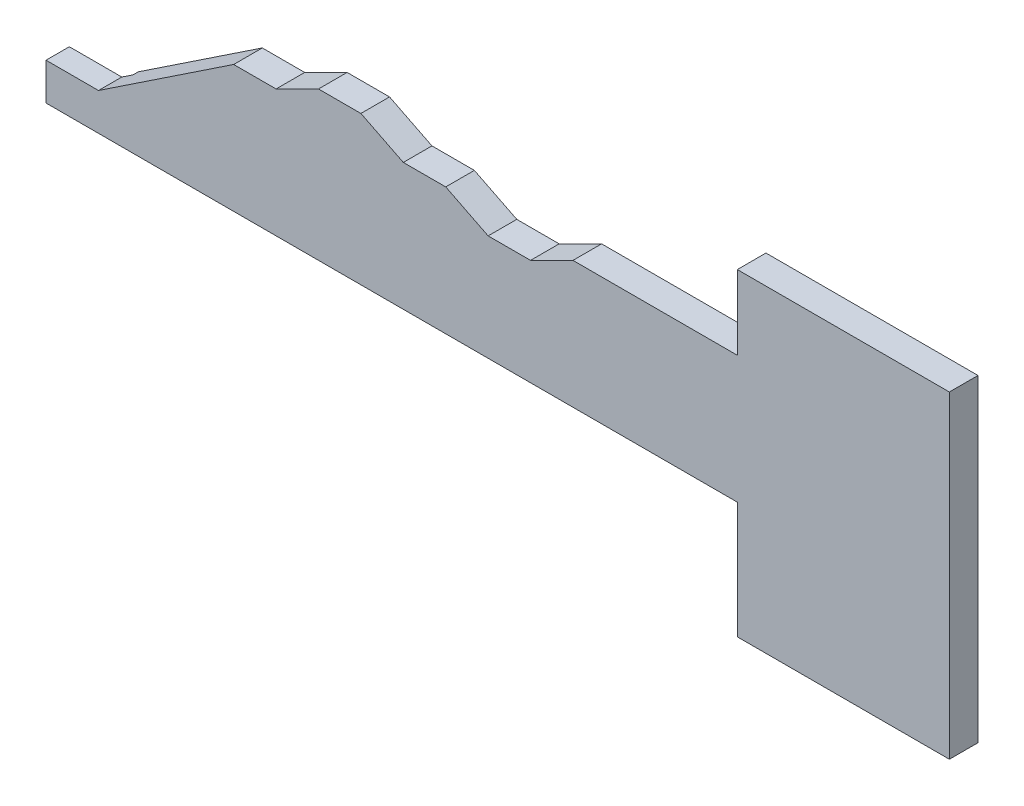
ISO-10303-21;
HEADER;
FILE_DESCRIPTION(('STEP AP214'),'2;1');
FILE_NAME('part.step','',(''),(''),'','','');
FILE_SCHEMA(('AUTOMOTIVE_DESIGN { 1 0 10303 214 1 1 1 1 }'));
ENDSEC;
DATA;
#1=APPLICATION_CONTEXT('core data for automotive mechanical design processes');
#2=APPLICATION_PROTOCOL_DEFINITION('international standard','automotive_design',2000,#1);
#3=PRODUCT_CONTEXT('',#1,'mechanical');
#4=PRODUCT('Part','Part','',(#3));
#5=PRODUCT_RELATED_PRODUCT_CATEGORY('part','',(#4));
#6=PRODUCT_DEFINITION_FORMATION('','',#4);
#7=PRODUCT_DEFINITION_CONTEXT('part definition',#1,'design');
#8=PRODUCT_DEFINITION('design','',#6,#7);
#9=PRODUCT_DEFINITION_SHAPE('','',#8);
#10=(LENGTH_UNIT() NAMED_UNIT(*) SI_UNIT(.MILLI.,.METRE.));
#11=(NAMED_UNIT(*) PLANE_ANGLE_UNIT() SI_UNIT($,.RADIAN.));
#12=(NAMED_UNIT(*) SI_UNIT($,.STERADIAN.) SOLID_ANGLE_UNIT());
#13=UNCERTAINTY_MEASURE_WITH_UNIT(LENGTH_MEASURE(1.E-05),#10,'distance_accuracy_value','');
#14=(GEOMETRIC_REPRESENTATION_CONTEXT(3) GLOBAL_UNCERTAINTY_ASSIGNED_CONTEXT((#13)) GLOBAL_UNIT_ASSIGNED_CONTEXT((#10,
#11,#12)) REPRESENTATION_CONTEXT('',''));
#15=CARTESIAN_POINT('',(0.,0.,0.));
#16=DIRECTION('',(0.,0.,1.));
#17=DIRECTION('',(1.,0.,0.));
#18=AXIS2_PLACEMENT_3D('',#15,#16,#17);
#19=CARTESIAN_POINT('',(-18.3076923076923,27.4615384615385,2.7));
#20=DIRECTION('',(-0.554700196225229,0.832050294337843,0.));
#21=DIRECTION('',(-0.832050294337843,-0.554700196225229,0.));
#22=AXIS2_PLACEMENT_3D('',#19,#20,#21);
#23=PLANE('',#22);
#24=DIRECTION('',(0.832050294337844,0.554700196225229,0.));
#25=VECTOR('',#24,1.);
#26=CARTESIAN_POINT('',(-18.3076923076923,27.4615384615385,0.));
#27=LINE('',#26,#25);
#28=CARTESIAN_POINT('',(-59.2,0.199999999999988,0.));
#29=VERTEX_POINT('',#28);
#30=CARTESIAN_POINT('',(-47.5,7.99999999999999,0.));
#31=VERTEX_POINT('',#30);
#32=EDGE_CURVE('E128',#29,#31,#27,.T.);
#33=ORIENTED_EDGE('',*,*,#32,.F.);
#34=DIRECTION('',(0.,0.,-1.));
#35=VECTOR('',#34,1.);
#36=CARTESIAN_POINT('',(-59.2,0.199999999999995,0.5));
#37=LINE('',#36,#35);
#38=CARTESIAN_POINT('',(-59.2,0.199999999999995,0.5));
#39=VERTEX_POINT('',#38);
#40=EDGE_CURVE('E62',#39,#29,#37,.T.);
#41=ORIENTED_EDGE('',*,*,#40,.F.);
#42=DIRECTION('',(-0.832050294337843,-0.554700196225229,0.));
#43=VECTOR('',#42,1.);
#44=CARTESIAN_POINT('',(-18.3076923076923,27.4615384615385,0.5));
#45=LINE('',#44,#43);
#46=CARTESIAN_POINT('',(-60.25,-0.499999999999992,0.5));
#47=VERTEX_POINT('',#46);
#48=EDGE_CURVE('E343',#39,#47,#45,.T.);
#49=ORIENTED_EDGE('',*,*,#48,.T.);
#50=DIRECTION('',(0.,0.,-1.));
#51=VECTOR('',#50,1.);
#52=CARTESIAN_POINT('',(-60.25,-0.499999999999997,2.7));
#53=LINE('',#52,#51);
#54=CARTESIAN_POINT('',(-60.25,-0.499999999999997,2.7));
#55=VERTEX_POINT('',#54);
#56=EDGE_CURVE('E11',#55,#47,#53,.T.);
#57=ORIENTED_EDGE('',*,*,#56,.F.);
#58=DIRECTION('',(0.832050294337844,0.554700196225229,0.));
#59=VECTOR('',#58,1.);
#60=CARTESIAN_POINT('',(-18.3076923076923,27.4615384615385,2.7));
#61=LINE('',#60,#59);
#62=CARTESIAN_POINT('',(-47.5,7.99999999999999,2.7));
#63=VERTEX_POINT('',#62);
#64=EDGE_CURVE('E267',#55,#63,#61,.T.);
#65=ORIENTED_EDGE('',*,*,#64,.T.);
#66=DIRECTION('',(0.,0.,-1.));
#67=VECTOR('',#66,1.);
#68=CARTESIAN_POINT('',(-47.5,7.99999999999999,2.7));
#69=LINE('',#68,#67);
#70=EDGE_CURVE('E212',#63,#31,#69,.T.);
#71=ORIENTED_EDGE('',*,*,#70,.T.);
#72=EDGE_LOOP('',(#33,#41,#49,#57,#65,#71));
#73=FACE_BOUND('',#72,.T.);
#74=ADVANCED_FACE('F47',(#73),#23,.T.);
#75=CARTESIAN_POINT('',(0.,-0.499999999999992,2.7));
#76=DIRECTION('',(0.,-1.,0.));
#77=DIRECTION('',(0.,0.,-1.));
#78=AXIS2_PLACEMENT_3D('',#75,#76,#77);
#79=PLANE('',#78);
#80=DIRECTION('',(-1.,0.,0.));
#81=VECTOR('',#80,1.);
#82=CARTESIAN_POINT('',(0.,-0.499999999999992,0.5));
#83=LINE('',#82,#81);
#84=CARTESIAN_POINT('',(-65.2,-0.499999999999992,0.5));
#85=VERTEX_POINT('',#84);
#86=EDGE_CURVE('E339',#47,#85,#83,.T.);
#87=ORIENTED_EDGE('',*,*,#86,.T.);
#88=DIRECTION('',(0.,0.,-1.));
#89=VECTOR('',#88,1.);
#90=CARTESIAN_POINT('',(-65.2,-0.499999999999992,2.7));
#91=LINE('',#90,#89);
#92=CARTESIAN_POINT('',(-65.2,-0.499999999999992,2.7));
#93=VERTEX_POINT('',#92);
#94=EDGE_CURVE('E55',#93,#85,#91,.T.);
#95=ORIENTED_EDGE('',*,*,#94,.F.);
#96=DIRECTION('',(-1.,0.,0.));
#97=VECTOR('',#96,1.);
#98=CARTESIAN_POINT('',(0.,-0.499999999999992,2.7));
#99=LINE('',#98,#97);
#100=EDGE_CURVE('E337',#55,#93,#99,.T.);
#101=ORIENTED_EDGE('',*,*,#100,.F.);
#102=ORIENTED_EDGE('',*,*,#56,.T.);
#103=EDGE_LOOP('',(#87,#95,#101,#102));
#104=FACE_BOUND('',#103,.T.);
#105=ADVANCED_FACE('F336',(#104),#79,.F.);
#106=CARTESIAN_POINT('',(-65.2,0.,2.7));
#107=DIRECTION('',(-1.,0.,0.));
#108=DIRECTION('',(0.,0.,1.));
#109=AXIS2_PLACEMENT_3D('',#106,#107,#108);
#110=PLANE('',#109);
#111=DIRECTION('',(0.,0.,-1.));
#112=VECTOR('',#111,1.);
#113=CARTESIAN_POINT('',(-65.2,-1.20000000000001,0.5));
#114=LINE('',#113,#112);
#115=CARTESIAN_POINT('',(-65.2,-1.20000000000001,0.5));
#116=VERTEX_POINT('',#115);
#117=CARTESIAN_POINT('',(-65.2,-1.20000000000001,0.));
#118=VERTEX_POINT('',#117);
#119=EDGE_CURVE('E219',#116,#118,#114,.T.);
#120=ORIENTED_EDGE('',*,*,#119,.T.);
#121=DIRECTION('',(0.,1.,0.));
#122=VECTOR('',#121,1.);
#123=CARTESIAN_POINT('',(-65.2,0.,0.));
#124=LINE('',#123,#122);
#125=CARTESIAN_POINT('',(-65.2,-3.99999999999999,0.));
#126=VERTEX_POINT('',#125);
#127=EDGE_CURVE('E218',#126,#118,#124,.T.);
#128=ORIENTED_EDGE('',*,*,#127,.F.);
#129=DIRECTION('',(0.,0.,-1.));
#130=VECTOR('',#129,1.);
#131=CARTESIAN_POINT('',(-65.2,-3.99999999999999,2.7));
#132=LINE('',#131,#130);
#133=CARTESIAN_POINT('',(-65.2,-3.99999999999999,2.7));
#134=VERTEX_POINT('',#133);
#135=EDGE_CURVE('E317',#134,#126,#132,.T.);
#136=ORIENTED_EDGE('',*,*,#135,.F.);
#137=DIRECTION('',(0.,1.,0.));
#138=VECTOR('',#137,1.);
#139=CARTESIAN_POINT('',(-65.2,0.,2.7));
#140=LINE('',#139,#138);
#141=EDGE_CURVE('E331',#134,#93,#140,.T.);
#142=ORIENTED_EDGE('',*,*,#141,.T.);
#143=ORIENTED_EDGE('',*,*,#94,.T.);
#144=DIRECTION('',(0.,-1.,0.));
#145=VECTOR('',#144,1.);
#146=CARTESIAN_POINT('',(-65.2,0.,0.5));
#147=LINE('',#146,#145);
#148=EDGE_CURVE('E329',#85,#116,#147,.T.);
#149=ORIENTED_EDGE('',*,*,#148,.T.);
#150=EDGE_LOOP('',(#120,#128,#136,#142,#143,#149));
#151=FACE_BOUND('',#150,.T.);
#152=ADVANCED_FACE('F326',(#151),#110,.T.);
#153=CARTESIAN_POINT('',(0.,-4.,2.7));
#154=DIRECTION('',(0.,-1.,0.));
#155=DIRECTION('',(1.,0.,0.));
#156=AXIS2_PLACEMENT_3D('',#153,#154,#155);
#157=PLANE('',#156);
#158=DIRECTION('',(-1.,0.,0.));
#159=VECTOR('',#158,1.);
#160=CARTESIAN_POINT('',(0.,-4.,0.));
#161=LINE('',#160,#159);
#162=CARTESIAN_POINT('',(0.,-4.,0.));
#163=VERTEX_POINT('',#162);
#164=EDGE_CURVE('E223',#163,#126,#161,.T.);
#165=ORIENTED_EDGE('',*,*,#164,.F.);
#166=DIRECTION('',(0.,0.,-1.));
#167=VECTOR('',#166,1.);
#168=CARTESIAN_POINT('',(0.,-4.,2.7));
#169=LINE('',#168,#167);
#170=CARTESIAN_POINT('',(0.,-4.,2.7));
#171=VERTEX_POINT('',#170);
#172=EDGE_CURVE('E314',#171,#163,#169,.T.);
#173=ORIENTED_EDGE('',*,*,#172,.F.);
#174=DIRECTION('',(-1.,0.,0.));
#175=VECTOR('',#174,1.);
#176=CARTESIAN_POINT('',(0.,-4.,2.7));
#177=LINE('',#176,#175);
#178=EDGE_CURVE('E379',#171,#134,#177,.T.);
#179=ORIENTED_EDGE('',*,*,#178,.T.);
#180=ORIENTED_EDGE('',*,*,#135,.T.);
#181=EDGE_LOOP('',(#165,#173,#179,#180));
#182=FACE_BOUND('',#181,.T.);
#183=ADVANCED_FACE('F460',(#182),#157,.T.);
#184=CARTESIAN_POINT('',(0.,0.,2.7));
#185=DIRECTION('',(1.,0.,0.));
#186=DIRECTION('',(0.,1.,0.));
#187=AXIS2_PLACEMENT_3D('',#184,#185,#186);
#188=PLANE('',#187);
#189=DIRECTION('',(0.,-1.,0.));
#190=VECTOR('',#189,1.);
#191=CARTESIAN_POINT('',(0.,0.,0.));
#192=LINE('',#191,#190);
#193=CARTESIAN_POINT('',(0.,-15.,0.));
#194=VERTEX_POINT('',#193);
#195=EDGE_CURVE('E227',#163,#194,#192,.T.);
#196=ORIENTED_EDGE('',*,*,#195,.T.);
#197=DIRECTION('',(0.,0.,-1.));
#198=VECTOR('',#197,1.);
#199=CARTESIAN_POINT('',(0.,-15.,2.7));
#200=LINE('',#199,#198);
#201=CARTESIAN_POINT('',(0.,-15.,2.7));
#202=VERTEX_POINT('',#201);
#203=EDGE_CURVE('E310',#202,#194,#200,.T.);
#204=ORIENTED_EDGE('',*,*,#203,.F.);
#205=DIRECTION('',(0.,-1.,0.));
#206=VECTOR('',#205,1.);
#207=CARTESIAN_POINT('',(0.,0.,2.7));
#208=LINE('',#207,#206);
#209=EDGE_CURVE('E383',#171,#202,#208,.T.);
#210=ORIENTED_EDGE('',*,*,#209,.F.);
#211=ORIENTED_EDGE('',*,*,#172,.T.);
#212=EDGE_LOOP('',(#196,#204,#210,#211));
#213=FACE_BOUND('',#212,.T.);
#214=ADVANCED_FACE('F456',(#213),#188,.F.);
#215=CARTESIAN_POINT('',(0.,-15.,2.7));
#216=DIRECTION('',(0.,1.,0.));
#217=DIRECTION('',(0.,0.,1.));
#218=AXIS2_PLACEMENT_3D('',#215,#216,#217);
#219=PLANE('',#218);
#220=DIRECTION('',(1.,0.,0.));
#221=VECTOR('',#220,1.);
#222=CARTESIAN_POINT('',(0.,-15.,0.));
#223=LINE('',#222,#221);
#224=CARTESIAN_POINT('',(20.,-15.,0.));
#225=VERTEX_POINT('',#224);
#226=EDGE_CURVE('E230',#194,#225,#223,.T.);
#227=ORIENTED_EDGE('',*,*,#226,.T.);
#228=DIRECTION('',(0.,0.,-1.));
#229=VECTOR('',#228,1.);
#230=CARTESIAN_POINT('',(20.,-15.,2.7));
#231=LINE('',#230,#229);
#232=CARTESIAN_POINT('',(20.,-15.,2.7));
#233=VERTEX_POINT('',#232);
#234=EDGE_CURVE('E306',#233,#225,#231,.T.);
#235=ORIENTED_EDGE('',*,*,#234,.F.);
#236=DIRECTION('',(1.,0.,0.));
#237=VECTOR('',#236,1.);
#238=CARTESIAN_POINT('',(0.,-15.,2.7));
#239=LINE('',#238,#237);
#240=EDGE_CURVE('E386',#202,#233,#239,.T.);
#241=ORIENTED_EDGE('',*,*,#240,.F.);
#242=ORIENTED_EDGE('',*,*,#203,.T.);
#243=EDGE_LOOP('',(#227,#235,#241,#242));
#244=FACE_BOUND('',#243,.T.);
#245=ADVANCED_FACE('F452',(#244),#219,.F.);
#246=CARTESIAN_POINT('',(20.,0.,2.7));
#247=DIRECTION('',(-1.,0.,0.));
#248=DIRECTION('',(0.,-1.,0.));
#249=AXIS2_PLACEMENT_3D('',#246,#247,#248);
#250=PLANE('',#249);
#251=DIRECTION('',(0.,1.,0.));
#252=VECTOR('',#251,1.);
#253=CARTESIAN_POINT('',(20.,0.,0.));
#254=LINE('',#253,#252);
#255=CARTESIAN_POINT('',(20.,15.,0.));
#256=VERTEX_POINT('',#255);
#257=EDGE_CURVE('E234',#225,#256,#254,.T.);
#258=ORIENTED_EDGE('',*,*,#257,.T.);
#259=DIRECTION('',(0.,0.,-1.));
#260=VECTOR('',#259,1.);
#261=CARTESIAN_POINT('',(20.,15.,2.7));
#262=LINE('',#261,#260);
#263=CARTESIAN_POINT('',(20.,15.,2.7));
#264=VERTEX_POINT('',#263);
#265=EDGE_CURVE('E302',#264,#256,#262,.T.);
#266=ORIENTED_EDGE('',*,*,#265,.F.);
#267=DIRECTION('',(0.,1.,0.));
#268=VECTOR('',#267,1.);
#269=CARTESIAN_POINT('',(20.,0.,2.7));
#270=LINE('',#269,#268);
#271=EDGE_CURVE('E390',#233,#264,#270,.T.);
#272=ORIENTED_EDGE('',*,*,#271,.F.);
#273=ORIENTED_EDGE('',*,*,#234,.T.);
#274=EDGE_LOOP('',(#258,#266,#272,#273));
#275=FACE_BOUND('',#274,.T.);
#276=ADVANCED_FACE('F448',(#275),#250,.F.);
#277=CARTESIAN_POINT('',(0.,15.,2.7));
#278=DIRECTION('',(0.,-1.,0.));
#279=DIRECTION('',(0.,0.,-1.));
#280=AXIS2_PLACEMENT_3D('',#277,#278,#279);
#281=PLANE('',#280);
#282=DIRECTION('',(-1.,0.,0.));
#283=VECTOR('',#282,1.);
#284=CARTESIAN_POINT('',(0.,15.,0.));
#285=LINE('',#284,#283);
#286=CARTESIAN_POINT('',(0.,15.,0.));
#287=VERTEX_POINT('',#286);
#288=EDGE_CURVE('E237',#256,#287,#285,.T.);
#289=ORIENTED_EDGE('',*,*,#288,.T.);
#290=DIRECTION('',(0.,0.,-1.));
#291=VECTOR('',#290,1.);
#292=CARTESIAN_POINT('',(0.,15.,2.7));
#293=LINE('',#292,#291);
#294=CARTESIAN_POINT('',(0.,15.,2.7));
#295=VERTEX_POINT('',#294);
#296=EDGE_CURVE('E298',#295,#287,#293,.T.);
#297=ORIENTED_EDGE('',*,*,#296,.F.);
#298=DIRECTION('',(-1.,0.,0.));
#299=VECTOR('',#298,1.);
#300=CARTESIAN_POINT('',(0.,15.,2.7));
#301=LINE('',#300,#299);
#302=EDGE_CURVE('E393',#264,#295,#301,.T.);
#303=ORIENTED_EDGE('',*,*,#302,.F.);
#304=ORIENTED_EDGE('',*,*,#265,.T.);
#305=EDGE_LOOP('',(#289,#297,#303,#304));
#306=FACE_BOUND('',#305,.T.);
#307=ADVANCED_FACE('F443',(#306),#281,.F.);
#308=CARTESIAN_POINT('',(0.,8.,0.));
#309=VERTEX_POINT('',#308);
#310=EDGE_CURVE('E231',#287,#309,#192,.T.);
#311=ORIENTED_EDGE('',*,*,#310,.T.);
#312=DIRECTION('',(0.,0.,-1.));
#313=VECTOR('',#312,1.);
#314=CARTESIAN_POINT('',(0.,8.,2.7));
#315=LINE('',#314,#313);
#316=CARTESIAN_POINT('',(0.,8.,2.7));
#317=VERTEX_POINT('',#316);
#318=EDGE_CURVE('E294',#317,#309,#315,.T.);
#319=ORIENTED_EDGE('',*,*,#318,.F.);
#320=EDGE_CURVE('E387',#295,#317,#208,.T.);
#321=ORIENTED_EDGE('',*,*,#320,.F.);
#322=ORIENTED_EDGE('',*,*,#296,.T.);
#323=EDGE_LOOP('',(#311,#319,#321,#322));
#324=FACE_BOUND('',#323,.T.);
#325=ADVANCED_FACE('F416',(#324),#188,.F.);
#326=CARTESIAN_POINT('',(0.,8.,2.7));
#327=DIRECTION('',(0.,-1.,0.));
#328=DIRECTION('',(1.,0.,0.));
#329=AXIS2_PLACEMENT_3D('',#326,#327,#328);
#330=PLANE('',#329);
#331=DIRECTION('',(-1.,0.,0.));
#332=VECTOR('',#331,1.);
#333=CARTESIAN_POINT('',(0.,8.,0.));
#334=LINE('',#333,#332);
#335=CARTESIAN_POINT('',(-15.5,8.,0.));
#336=VERTEX_POINT('',#335);
#337=EDGE_CURVE('E240',#309,#336,#334,.T.);
#338=ORIENTED_EDGE('',*,*,#337,.T.);
#339=DIRECTION('',(0.,0.,-1.));
#340=VECTOR('',#339,1.);
#341=CARTESIAN_POINT('',(-15.5,8.,2.7));
#342=LINE('',#341,#340);
#343=CARTESIAN_POINT('',(-15.5,8.,2.7));
#344=VERTEX_POINT('',#343);
#345=EDGE_CURVE('E290',#344,#336,#342,.T.);
#346=ORIENTED_EDGE('',*,*,#345,.F.);
#347=DIRECTION('',(-1.,0.,0.));
#348=VECTOR('',#347,1.);
#349=CARTESIAN_POINT('',(0.,8.,2.7));
#350=LINE('',#349,#348);
#351=EDGE_CURVE('E396',#317,#344,#350,.T.);
#352=ORIENTED_EDGE('',*,*,#351,.F.);
#353=ORIENTED_EDGE('',*,*,#318,.T.);
#354=EDGE_LOOP('',(#338,#346,#352,#353));
#355=FACE_BOUND('',#354,.T.);
#356=ADVANCED_FACE('F423',(#355),#330,.F.);
#357=CARTESIAN_POINT('',(-6.30000000000001,12.6,2.7));
#358=DIRECTION('',(0.447213595499958,-0.894427190999916,0.));
#359=DIRECTION('',(0.894427190999916,0.447213595499958,0.));
#360=AXIS2_PLACEMENT_3D('',#357,#358,#359);
#361=PLANE('',#360);
#362=DIRECTION('',(-0.894427190999916,-0.447213595499958,0.));
#363=VECTOR('',#362,1.);
#364=CARTESIAN_POINT('',(-6.30000000000001,12.6,0.));
#365=LINE('',#364,#363);
#366=CARTESIAN_POINT('',(-19.5,6.,0.));
#367=VERTEX_POINT('',#366);
#368=EDGE_CURVE('E243',#336,#367,#365,.T.);
#369=ORIENTED_EDGE('',*,*,#368,.T.);
#370=DIRECTION('',(0.,0.,-1.));
#371=VECTOR('',#370,1.);
#372=CARTESIAN_POINT('',(-19.5,6.,2.7));
#373=LINE('',#372,#371);
#374=CARTESIAN_POINT('',(-19.5,6.,2.7));
#375=VERTEX_POINT('',#374);
#376=EDGE_CURVE('E286',#375,#367,#373,.T.);
#377=ORIENTED_EDGE('',*,*,#376,.F.);
#378=DIRECTION('',(-0.894427190999916,-0.447213595499958,0.));
#379=VECTOR('',#378,1.);
#380=CARTESIAN_POINT('',(-6.30000000000001,12.6,2.7));
#381=LINE('',#380,#379);
#382=EDGE_CURVE('E399',#344,#375,#381,.T.);
#383=ORIENTED_EDGE('',*,*,#382,.F.);
#384=ORIENTED_EDGE('',*,*,#345,.T.);
#385=EDGE_LOOP('',(#369,#377,#383,#384));
#386=FACE_BOUND('',#385,.T.);
#387=ADVANCED_FACE('F431',(#386),#361,.F.);
#388=CARTESIAN_POINT('',(0.,6.,2.7));
#389=DIRECTION('',(0.,-1.,0.));
#390=DIRECTION('',(1.,0.,0.));
#391=AXIS2_PLACEMENT_3D('',#388,#389,#390);
#392=PLANE('',#391);
#393=DIRECTION('',(-1.,0.,0.));
#394=VECTOR('',#393,1.);
#395=CARTESIAN_POINT('',(0.,6.,0.));
#396=LINE('',#395,#394);
#397=CARTESIAN_POINT('',(-23.5,6.,0.));
#398=VERTEX_POINT('',#397);
#399=EDGE_CURVE('E246',#367,#398,#396,.T.);
#400=ORIENTED_EDGE('',*,*,#399,.T.);
#401=DIRECTION('',(0.,0.,-1.));
#402=VECTOR('',#401,1.);
#403=CARTESIAN_POINT('',(-23.5,6.,2.7));
#404=LINE('',#403,#402);
#405=CARTESIAN_POINT('',(-23.5,6.,2.7));
#406=VERTEX_POINT('',#405);
#407=EDGE_CURVE('E282',#406,#398,#404,.T.);
#408=ORIENTED_EDGE('',*,*,#407,.F.);
#409=DIRECTION('',(-1.,0.,0.));
#410=VECTOR('',#409,1.);
#411=CARTESIAN_POINT('',(0.,6.,2.7));
#412=LINE('',#411,#410);
#413=EDGE_CURVE('E402',#375,#406,#412,.T.);
#414=ORIENTED_EDGE('',*,*,#413,.F.);
#415=ORIENTED_EDGE('',*,*,#376,.T.);
#416=EDGE_LOOP('',(#400,#408,#414,#415));
#417=FACE_BOUND('',#416,.T.);
#418=ADVANCED_FACE('F435',(#417),#392,.F.);
#419=CARTESIAN_POINT('',(-2.3,-4.60000000000001,2.7));
#420=DIRECTION('',(-0.447213595499958,-0.894427190999916,0.));
#421=DIRECTION('',(0.894427190999916,-0.447213595499958,0.));
#422=AXIS2_PLACEMENT_3D('',#419,#420,#421);
#423=PLANE('',#422);
#424=DIRECTION('',(-0.894427190999916,0.447213595499958,0.));
#425=VECTOR('',#424,1.);
#426=CARTESIAN_POINT('',(-2.3,-4.60000000000001,0.));
#427=LINE('',#426,#425);
#428=CARTESIAN_POINT('',(-27.5,8.,0.));
#429=VERTEX_POINT('',#428);
#430=EDGE_CURVE('E249',#398,#429,#427,.T.);
#431=ORIENTED_EDGE('',*,*,#430,.T.);
#432=DIRECTION('',(0.,0.,-1.));
#433=VECTOR('',#432,1.);
#434=CARTESIAN_POINT('',(-27.5,8.,2.7));
#435=LINE('',#434,#433);
#436=CARTESIAN_POINT('',(-27.5,8.,2.7));
#437=VERTEX_POINT('',#436);
#438=EDGE_CURVE('E278',#437,#429,#435,.T.);
#439=ORIENTED_EDGE('',*,*,#438,.F.);
#440=DIRECTION('',(-0.894427190999916,0.447213595499958,0.));
#441=VECTOR('',#440,1.);
#442=CARTESIAN_POINT('',(-2.3,-4.60000000000001,2.7));
#443=LINE('',#442,#441);
#444=EDGE_CURVE('E405',#406,#437,#443,.T.);
#445=ORIENTED_EDGE('',*,*,#444,.F.);
#446=ORIENTED_EDGE('',*,*,#407,.T.);
#447=EDGE_LOOP('',(#431,#439,#445,#446));
#448=FACE_BOUND('',#447,.T.);
#449=ADVANCED_FACE('F499',(#448),#423,.F.);
#450=CARTESIAN_POINT('',(0.,8.,2.7));
#451=DIRECTION('',(0.,-1.,0.));
#452=DIRECTION('',(0.,0.,-1.));
#453=AXIS2_PLACEMENT_3D('',#450,#451,#452);
#454=PLANE('',#453);
#455=DIRECTION('',(-1.,0.,0.));
#456=VECTOR('',#455,1.);
#457=CARTESIAN_POINT('',(0.,8.,0.));
#458=LINE('',#457,#456);
#459=CARTESIAN_POINT('',(-31.5,8.,0.));
#460=VERTEX_POINT('',#459);
#461=EDGE_CURVE('E252',#429,#460,#458,.T.);
#462=ORIENTED_EDGE('',*,*,#461,.T.);
#463=DIRECTION('',(0.,0.,-1.));
#464=VECTOR('',#463,1.);
#465=CARTESIAN_POINT('',(-31.5,8.,2.7));
#466=LINE('',#465,#464);
#467=CARTESIAN_POINT('',(-31.5,8.,2.7));
#468=VERTEX_POINT('',#467);
#469=EDGE_CURVE('E274',#468,#460,#466,.T.);
#470=ORIENTED_EDGE('',*,*,#469,.F.);
#471=DIRECTION('',(-1.,0.,0.));
#472=VECTOR('',#471,1.);
#473=CARTESIAN_POINT('',(0.,8.,2.7));
#474=LINE('',#473,#472);
#475=EDGE_CURVE('E408',#437,#468,#474,.T.);
#476=ORIENTED_EDGE('',*,*,#475,.F.);
#477=ORIENTED_EDGE('',*,*,#438,.T.);
#478=EDGE_LOOP('',(#462,#470,#476,#477));
#479=FACE_BOUND('',#478,.T.);
#480=ADVANCED_FACE('F497',(#479),#454,.F.);
#481=CARTESIAN_POINT('',(-3.10000000000002,-6.20000000000002,2.7));
#482=DIRECTION('',(-0.447213595499958,-0.894427190999916,0.));
#483=DIRECTION('',(0.894427190999916,-0.447213595499959,0.));
#484=AXIS2_PLACEMENT_3D('',#481,#482,#483);
#485=PLANE('',#484);
#486=DIRECTION('',(-0.894427190999916,0.447213595499959,0.));
#487=VECTOR('',#486,1.);
#488=CARTESIAN_POINT('',(-3.10000000000002,-6.20000000000002,0.));
#489=LINE('',#488,#487);
#490=CARTESIAN_POINT('',(-35.5,10.,0.));
#491=VERTEX_POINT('',#490);
#492=EDGE_CURVE('E255',#460,#491,#489,.T.);
#493=ORIENTED_EDGE('',*,*,#492,.T.);
#494=DIRECTION('',(0.,0.,-1.));
#495=VECTOR('',#494,1.);
#496=CARTESIAN_POINT('',(-35.5,10.,2.7));
#497=LINE('',#496,#495);
#498=CARTESIAN_POINT('',(-35.5,10.,2.7));
#499=VERTEX_POINT('',#498);
#500=EDGE_CURVE('E204',#499,#491,#497,.T.);
#501=ORIENTED_EDGE('',*,*,#500,.F.);
#502=DIRECTION('',(-0.894427190999916,0.447213595499959,0.));
#503=VECTOR('',#502,1.);
#504=CARTESIAN_POINT('',(-3.10000000000002,-6.20000000000002,2.7));
#505=LINE('',#504,#503);
#506=EDGE_CURVE('E190',#468,#499,#505,.T.);
#507=ORIENTED_EDGE('',*,*,#506,.F.);
#508=ORIENTED_EDGE('',*,*,#469,.T.);
#509=EDGE_LOOP('',(#493,#501,#507,#508));
#510=FACE_BOUND('',#509,.T.);
#511=ADVANCED_FACE('F493',(#510),#485,.F.);
#512=CARTESIAN_POINT('',(0.,10.,2.7));
#513=DIRECTION('',(0.,-1.,0.));
#514=DIRECTION('',(1.,0.,0.));
#515=AXIS2_PLACEMENT_3D('',#512,#513,#514);
#516=PLANE('',#515);
#517=DIRECTION('',(-1.,0.,0.));
#518=VECTOR('',#517,1.);
#519=CARTESIAN_POINT('',(0.,10.,0.));
#520=LINE('',#519,#518);
#521=CARTESIAN_POINT('',(-39.5,9.99999999999999,0.));
#522=VERTEX_POINT('',#521);
#523=EDGE_CURVE('E200',#491,#522,#520,.T.);
#524=ORIENTED_EDGE('',*,*,#523,.T.);
#525=DIRECTION('',(0.,0.,-1.));
#526=VECTOR('',#525,1.);
#527=CARTESIAN_POINT('',(-39.5,9.99999999999999,2.7));
#528=LINE('',#527,#526);
#529=CARTESIAN_POINT('',(-39.5,9.99999999999999,2.7));
#530=VERTEX_POINT('',#529);
#531=EDGE_CURVE('E197',#530,#522,#528,.T.);
#532=ORIENTED_EDGE('',*,*,#531,.F.);
#533=DIRECTION('',(-1.,0.,0.));
#534=VECTOR('',#533,1.);
#535=CARTESIAN_POINT('',(0.,10.,2.7));
#536=LINE('',#535,#534);
#537=EDGE_CURVE('E183',#499,#530,#536,.T.);
#538=ORIENTED_EDGE('',*,*,#537,.F.);
#539=ORIENTED_EDGE('',*,*,#500,.T.);
#540=EDGE_LOOP('',(#524,#532,#538,#539));
#541=FACE_BOUND('',#540,.T.);
#542=ADVANCED_FACE('F198',(#541),#516,.F.);
#543=CARTESIAN_POINT('',(-11.9,23.8,2.7));
#544=DIRECTION('',(0.447213595499958,-0.894427190999916,0.));
#545=DIRECTION('',(0.894427190999916,0.447213595499958,0.));
#546=AXIS2_PLACEMENT_3D('',#543,#544,#545);
#547=PLANE('',#546);
#548=DIRECTION('',(-0.894427190999916,-0.447213595499958,0.));
#549=VECTOR('',#548,1.);
#550=CARTESIAN_POINT('',(-11.9,23.8,0.));
#551=LINE('',#550,#549);
#552=CARTESIAN_POINT('',(-43.5,7.99999999999999,0.));
#553=VERTEX_POINT('',#552);
#554=EDGE_CURVE('E260',#522,#553,#551,.T.);
#555=ORIENTED_EDGE('',*,*,#554,.T.);
#556=DIRECTION('',(0.,0.,-1.));
#557=VECTOR('',#556,1.);
#558=CARTESIAN_POINT('',(-43.5,7.99999999999999,2.7));
#559=LINE('',#558,#557);
#560=CARTESIAN_POINT('',(-43.5,7.99999999999999,2.7));
#561=VERTEX_POINT('',#560);
#562=EDGE_CURVE('E205',#561,#553,#559,.T.);
#563=ORIENTED_EDGE('',*,*,#562,.F.);
#564=DIRECTION('',(-0.894427190999916,-0.447213595499958,0.));
#565=VECTOR('',#564,1.);
#566=CARTESIAN_POINT('',(-11.9,23.8,2.7));
#567=LINE('',#566,#565);
#568=EDGE_CURVE('E187',#530,#561,#567,.T.);
#569=ORIENTED_EDGE('',*,*,#568,.F.);
#570=ORIENTED_EDGE('',*,*,#531,.T.);
#571=EDGE_LOOP('',(#555,#563,#569,#570));
#572=FACE_BOUND('',#571,.T.);
#573=ADVANCED_FACE('F207',(#572),#547,.F.);
#574=CARTESIAN_POINT('',(0.,8.00000000000002,2.7));
#575=DIRECTION('',(0.,-1.,0.));
#576=DIRECTION('',(1.,0.,0.));
#577=AXIS2_PLACEMENT_3D('',#574,#575,#576);
#578=PLANE('',#577);
#579=DIRECTION('',(-1.,0.,0.));
#580=VECTOR('',#579,1.);
#581=CARTESIAN_POINT('',(0.,8.00000000000002,0.));
#582=LINE('',#581,#580);
#583=EDGE_CURVE('E263',#553,#31,#582,.T.);
#584=ORIENTED_EDGE('',*,*,#583,.T.);
#585=ORIENTED_EDGE('',*,*,#70,.F.);
#586=DIRECTION('',(-1.,0.,0.));
#587=VECTOR('',#586,1.);
#588=CARTESIAN_POINT('',(0.,8.00000000000002,2.7));
#589=LINE('',#588,#587);
#590=EDGE_CURVE('E71',#561,#63,#589,.T.);
#591=ORIENTED_EDGE('',*,*,#590,.F.);
#592=ORIENTED_EDGE('',*,*,#562,.T.);
#593=EDGE_LOOP('',(#584,#585,#591,#592));
#594=FACE_BOUND('',#593,.T.);
#595=ADVANCED_FACE('F489',(#594),#578,.F.);
#596=CARTESIAN_POINT('',(0.,0.,2.7));
#597=DIRECTION('',(0.,0.,1.));
#598=DIRECTION('',(1.,0.,0.));
#599=AXIS2_PLACEMENT_3D('',#596,#597,#598);
#600=PLANE('',#599);
#601=ORIENTED_EDGE('',*,*,#64,.F.);
#602=ORIENTED_EDGE('',*,*,#100,.T.);
#603=ORIENTED_EDGE('',*,*,#141,.F.);
#604=ORIENTED_EDGE('',*,*,#178,.F.);
#605=ORIENTED_EDGE('',*,*,#209,.T.);
#606=ORIENTED_EDGE('',*,*,#240,.T.);
#607=ORIENTED_EDGE('',*,*,#271,.T.);
#608=ORIENTED_EDGE('',*,*,#302,.T.);
#609=ORIENTED_EDGE('',*,*,#320,.T.);
#610=ORIENTED_EDGE('',*,*,#351,.T.);
#611=ORIENTED_EDGE('',*,*,#382,.T.);
#612=ORIENTED_EDGE('',*,*,#413,.T.);
#613=ORIENTED_EDGE('',*,*,#444,.T.);
#614=ORIENTED_EDGE('',*,*,#475,.T.);
#615=ORIENTED_EDGE('',*,*,#506,.T.);
#616=ORIENTED_EDGE('',*,*,#537,.T.);
#617=ORIENTED_EDGE('',*,*,#568,.T.);
#618=ORIENTED_EDGE('',*,*,#590,.T.);
#619=EDGE_LOOP('',(#601,#602,#603,#604,#605,#606,#607,#608,#609,#610,#611,#612,#613,#614,#615,
#616,#617,#618));
#620=FACE_BOUND('',#619,.T.);
#621=ADVANCED_FACE('F185',(#620),#600,.T.);
#622=CARTESIAN_POINT('',(0.,0.,0.));
#623=DIRECTION('',(0.,0.,1.));
#624=DIRECTION('',(1.,0.,0.));
#625=AXIS2_PLACEMENT_3D('',#622,#623,#624);
#626=PLANE('',#625);
#627=ORIENTED_EDGE('',*,*,#127,.T.);
#628=DIRECTION('',(-1.,0.,0.));
#629=VECTOR('',#628,1.);
#630=CARTESIAN_POINT('',(0.,-1.2,0.));
#631=LINE('',#630,#629);
#632=CARTESIAN_POINT('',(2.99999999999999,-1.2,0.));
#633=VERTEX_POINT('',#632);
#634=EDGE_CURVE('E353',#633,#118,#631,.T.);
#635=ORIENTED_EDGE('',*,*,#634,.F.);
#636=DIRECTION('',(0.,-1.,0.));
#637=VECTOR('',#636,1.);
#638=CARTESIAN_POINT('',(2.99999999999999,0.,0.));
#639=LINE('',#638,#637);
#640=CARTESIAN_POINT('',(2.99999999999999,0.200000000000002,0.));
#641=VERTEX_POINT('',#640);
#642=EDGE_CURVE('E357',#641,#633,#639,.T.);
#643=ORIENTED_EDGE('',*,*,#642,.F.);
#644=DIRECTION('',(-1.,0.,0.));
#645=VECTOR('',#644,1.);
#646=CARTESIAN_POINT('',(0.,0.200000000000001,0.));
#647=LINE('',#646,#645);
#648=EDGE_CURVE('E361',#641,#29,#647,.T.);
#649=ORIENTED_EDGE('',*,*,#648,.T.);
#650=ORIENTED_EDGE('',*,*,#32,.T.);
#651=ORIENTED_EDGE('',*,*,#583,.F.);
#652=ORIENTED_EDGE('',*,*,#554,.F.);
#653=ORIENTED_EDGE('',*,*,#523,.F.);
#654=ORIENTED_EDGE('',*,*,#492,.F.);
#655=ORIENTED_EDGE('',*,*,#461,.F.);
#656=ORIENTED_EDGE('',*,*,#430,.F.);
#657=ORIENTED_EDGE('',*,*,#399,.F.);
#658=ORIENTED_EDGE('',*,*,#368,.F.);
#659=ORIENTED_EDGE('',*,*,#337,.F.);
#660=ORIENTED_EDGE('',*,*,#310,.F.);
#661=ORIENTED_EDGE('',*,*,#288,.F.);
#662=ORIENTED_EDGE('',*,*,#257,.F.);
#663=ORIENTED_EDGE('',*,*,#226,.F.);
#664=ORIENTED_EDGE('',*,*,#195,.F.);
#665=ORIENTED_EDGE('',*,*,#164,.T.);
#666=EDGE_LOOP('',(#627,#635,#643,#649,#650,#651,#652,#653,#654,#655,#656,#657,#658,#659,#660,
#661,#662,#663,#664,#665));
#667=FACE_BOUND('',#666,.T.);
#668=ADVANCED_FACE('F426',(#667),#626,.F.);
#669=CARTESIAN_POINT('',(0.,-1.2,0.5));
#670=DIRECTION('',(0.,-1.,0.));
#671=DIRECTION('',(1.,0.,0.));
#672=AXIS2_PLACEMENT_3D('',#669,#670,#671);
#673=PLANE('',#672);
#674=ORIENTED_EDGE('',*,*,#634,.T.);
#675=ORIENTED_EDGE('',*,*,#119,.F.);
#676=DIRECTION('',(-1.,0.,0.));
#677=VECTOR('',#676,1.);
#678=CARTESIAN_POINT('',(0.,-1.2,0.5));
#679=LINE('',#678,#677);
#680=CARTESIAN_POINT('',(2.99999999999999,-1.2,0.5));
#681=VERTEX_POINT('',#680);
#682=EDGE_CURVE('E667',#681,#116,#679,.T.);
#683=ORIENTED_EDGE('',*,*,#682,.F.);
#684=DIRECTION('',(0.,0.,-1.));
#685=VECTOR('',#684,1.);
#686=CARTESIAN_POINT('',(2.99999999999999,-1.2,0.5));
#687=LINE('',#686,#685);
#688=EDGE_CURVE('E367',#681,#633,#687,.T.);
#689=ORIENTED_EDGE('',*,*,#688,.T.);
#690=EDGE_LOOP('',(#674,#675,#683,#689));
#691=FACE_BOUND('',#690,.T.);
#692=ADVANCED_FACE('F608',(#691),#673,.F.);
#693=CARTESIAN_POINT('',(2.99999999999999,0.,0.5));
#694=DIRECTION('',(1.,0.,0.));
#695=DIRECTION('',(0.,0.,-1.));
#696=AXIS2_PLACEMENT_3D('',#693,#694,#695);
#697=PLANE('',#696);
#698=ORIENTED_EDGE('',*,*,#642,.T.);
#699=ORIENTED_EDGE('',*,*,#688,.F.);
#700=DIRECTION('',(0.,-1.,0.));
#701=VECTOR('',#700,1.);
#702=CARTESIAN_POINT('',(2.99999999999999,0.,0.5));
#703=LINE('',#702,#701);
#704=CARTESIAN_POINT('',(2.99999999999999,0.200000000000002,0.5));
#705=VERTEX_POINT('',#704);
#706=EDGE_CURVE('E485',#705,#681,#703,.T.);
#707=ORIENTED_EDGE('',*,*,#706,.F.);
#708=DIRECTION('',(0.,0.,-1.));
#709=VECTOR('',#708,1.);
#710=CARTESIAN_POINT('',(2.99999999999999,0.200000000000002,0.5));
#711=LINE('',#710,#709);
#712=EDGE_CURVE('E347',#705,#641,#711,.T.);
#713=ORIENTED_EDGE('',*,*,#712,.T.);
#714=EDGE_LOOP('',(#698,#699,#707,#713));
#715=FACE_BOUND('',#714,.T.);
#716=ADVANCED_FACE('F483',(#715),#697,.F.);
#717=CARTESIAN_POINT('',(0.,0.200000000000001,0.5));
#718=DIRECTION('',(0.,-1.,0.));
#719=DIRECTION('',(1.,0.,0.));
#720=AXIS2_PLACEMENT_3D('',#717,#718,#719);
#721=PLANE('',#720);
#722=ORIENTED_EDGE('',*,*,#648,.F.);
#723=ORIENTED_EDGE('',*,*,#712,.F.);
#724=DIRECTION('',(-1.,0.,0.));
#725=VECTOR('',#724,1.);
#726=CARTESIAN_POINT('',(0.,0.200000000000001,0.5));
#727=LINE('',#726,#725);
#728=EDGE_CURVE('E349',#705,#39,#727,.T.);
#729=ORIENTED_EDGE('',*,*,#728,.T.);
#730=ORIENTED_EDGE('',*,*,#40,.T.);
#731=EDGE_LOOP('',(#722,#723,#729,#730));
#732=FACE_BOUND('',#731,.T.);
#733=ADVANCED_FACE('F487',(#732),#721,.T.);
#734=CARTESIAN_POINT('',(0.,0.,0.5));
#735=DIRECTION('',(0.,0.,-1.));
#736=DIRECTION('',(-1.,0.,0.));
#737=AXIS2_PLACEMENT_3D('',#734,#735,#736);
#738=PLANE('',#737);
#739=ORIENTED_EDGE('',*,*,#148,.F.);
#740=ORIENTED_EDGE('',*,*,#86,.F.);
#741=ORIENTED_EDGE('',*,*,#48,.F.);
#742=ORIENTED_EDGE('',*,*,#728,.F.);
#743=ORIENTED_EDGE('',*,*,#706,.T.);
#744=ORIENTED_EDGE('',*,*,#682,.T.);
#745=EDGE_LOOP('',(#739,#740,#741,#742,#743,#744));
#746=FACE_BOUND('',#745,.T.);
#747=ADVANCED_FACE('F656',(#746),#738,.T.);
#748=CLOSED_SHELL('',(#74,#105,#152,#183,#214,#245,#276,#307,#325,#356,#387,#418,#449,#480,#511,
#542,#573,#595,#621,#668,#692,#716,#733,#747));
#749=MANIFOLD_SOLID_BREP('B2',#748);
#750=ADVANCED_BREP_SHAPE_REPRESENTATION('',(#18,#749),#14);
#751=SHAPE_DEFINITION_REPRESENTATION(#9,#750);
ENDSEC;
END-ISO-10303-21;
